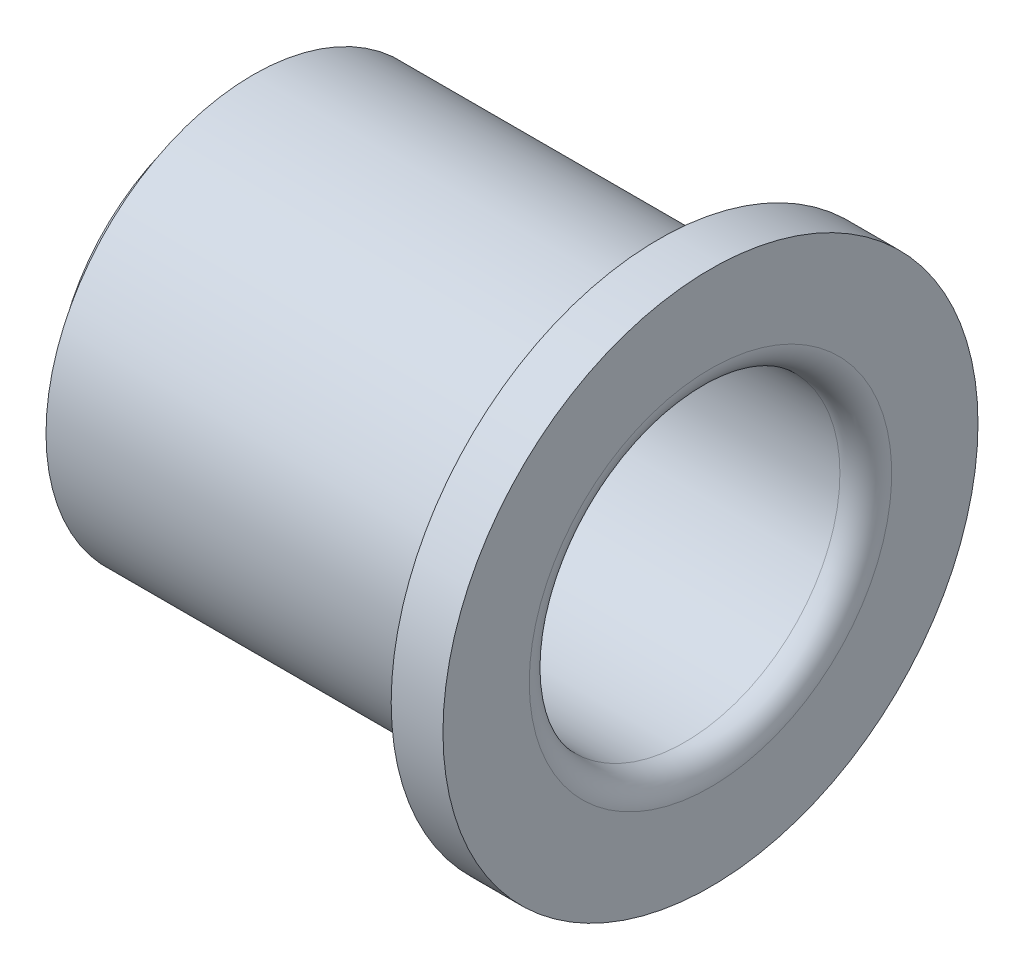
ISO-10303-21;
HEADER;
FILE_DESCRIPTION(('STEP AP214'),'2;1');
FILE_NAME('part.step','',(''),(''),'','','');
FILE_SCHEMA(('AUTOMOTIVE_DESIGN { 1 0 10303 214 1 1 1 1 }'));
ENDSEC;
DATA;
#1=APPLICATION_CONTEXT('core data for automotive mechanical design processes');
#2=APPLICATION_PROTOCOL_DEFINITION('international standard','automotive_design',2000,#1);
#3=PRODUCT_CONTEXT('',#1,'mechanical');
#4=PRODUCT('Part','Part','',(#3));
#5=PRODUCT_RELATED_PRODUCT_CATEGORY('part','',(#4));
#6=PRODUCT_DEFINITION_FORMATION('','',#4);
#7=PRODUCT_DEFINITION_CONTEXT('part definition',#1,'design');
#8=PRODUCT_DEFINITION('design','',#6,#7);
#9=PRODUCT_DEFINITION_SHAPE('','',#8);
#10=(LENGTH_UNIT() NAMED_UNIT(*) SI_UNIT(.MILLI.,.METRE.));
#11=(NAMED_UNIT(*) PLANE_ANGLE_UNIT() SI_UNIT($,.RADIAN.));
#12=(NAMED_UNIT(*) SI_UNIT($,.STERADIAN.) SOLID_ANGLE_UNIT());
#13=UNCERTAINTY_MEASURE_WITH_UNIT(LENGTH_MEASURE(1.E-05),#10,'distance_accuracy_value','');
#14=(GEOMETRIC_REPRESENTATION_CONTEXT(3) GLOBAL_UNCERTAINTY_ASSIGNED_CONTEXT((#13)) GLOBAL_UNIT_ASSIGNED_CONTEXT((#10,
#11,#12)) REPRESENTATION_CONTEXT('',''));
#15=CARTESIAN_POINT('',(0.,0.,0.));
#16=DIRECTION('',(0.,0.,1.));
#17=DIRECTION('',(1.,0.,0.));
#18=AXIS2_PLACEMENT_3D('',#15,#16,#17);
#19=CARTESIAN_POINT('',(-56.,20.,0.));
#20=DIRECTION('',(1.,0.,0.));
#21=DIRECTION('',(0.,0.,-1.));
#22=AXIS2_PLACEMENT_3D('',#19,#20,#21);
#23=PLANE('',#22);
#24=CARTESIAN_POINT('',(-56.,0.,0.));
#25=DIRECTION('',(-1.,0.,0.));
#26=DIRECTION('',(0.,0.,1.));
#27=AXIS2_PLACEMENT_3D('',#24,#25,#26);
#28=CIRCLE('',#27,18.);
#29=CARTESIAN_POINT('',(-56.,0.,18.));
#30=VERTEX_POINT('',#29);
#31=EDGE_CURVE('E10',#30,#30,#28,.T.);
#32=ORIENTED_EDGE('',*,*,#31,.F.);
#33=EDGE_LOOP('',(#32));
#34=FACE_BOUND('',#33,.T.);
#35=CARTESIAN_POINT('',(-56.,0.,0.));
#36=DIRECTION('',(-1.,0.,0.));
#37=DIRECTION('',(0.,0.,1.));
#38=AXIS2_PLACEMENT_3D('',#35,#36,#37);
#39=CIRCLE('',#38,20.);
#40=CARTESIAN_POINT('',(-56.,0.,20.));
#41=VERTEX_POINT('',#40);
#42=EDGE_CURVE('E377',#41,#41,#39,.T.);
#43=ORIENTED_EDGE('',*,*,#42,.T.);
#44=EDGE_LOOP('',(#43));
#45=FACE_BOUND('',#44,.T.);
#46=ADVANCED_FACE('F346',(#34,#45),#23,.F.);
#47=CARTESIAN_POINT('',(-50.6851256281407,0.,0.));
#48=DIRECTION('',(-1.,0.,0.));
#49=DIRECTION('',(0.,0.,1.));
#50=AXIS2_PLACEMENT_3D('',#47,#48,#49);
#51=CYLINDRICAL_SURFACE('',#50,18.);
#52=CARTESIAN_POINT('',(-3.00000000000002,0.,0.));
#53=DIRECTION('',(-1.,0.,0.));
#54=DIRECTION('',(0.,0.,1.));
#55=AXIS2_PLACEMENT_3D('',#52,#53,#54);
#56=CIRCLE('',#55,18.);
#57=CARTESIAN_POINT('',(-3.00000000000002,0.,18.));
#58=VERTEX_POINT('',#57);
#59=EDGE_CURVE('E352',#58,#58,#56,.T.);
#60=ORIENTED_EDGE('',*,*,#59,.F.);
#61=EDGE_LOOP('',(#60));
#62=FACE_BOUND('',#61,.T.);
#63=ORIENTED_EDGE('',*,*,#31,.T.);
#64=EDGE_LOOP('',(#63));
#65=FACE_BOUND('',#64,.T.);
#66=ADVANCED_FACE('F420',(#62,#65),#51,.F.);
#67=CARTESIAN_POINT('',(-3.,0.,0.));
#68=DIRECTION('',(-1.,0.,0.));
#69=DIRECTION('',(0.,0.,1.));
#70=AXIS2_PLACEMENT_3D('',#67,#68,#69);
#71=TOROIDAL_SURFACE('',#70,21.,3.);
#72=CARTESIAN_POINT('',(0.,0.,0.));
#73=DIRECTION('',(-1.,0.,0.));
#74=DIRECTION('',(0.,0.,1.));
#75=AXIS2_PLACEMENT_3D('',#72,#73,#74);
#76=CIRCLE('',#75,21.);
#77=CARTESIAN_POINT('',(0.,0.,21.));
#78=VERTEX_POINT('',#77);
#79=EDGE_CURVE('E356',#78,#78,#76,.T.);
#80=ORIENTED_EDGE('',*,*,#79,.F.);
#81=EDGE_LOOP('',(#80));
#82=FACE_BOUND('',#81,.T.);
#83=ORIENTED_EDGE('',*,*,#59,.T.);
#84=EDGE_LOOP('',(#83));
#85=FACE_BOUND('',#84,.T.);
#86=ADVANCED_FACE('F415',(#82,#85),#71,.T.);
#87=CARTESIAN_POINT('',(0.,21.,0.));
#88=DIRECTION('',(-1.,0.,0.));
#89=DIRECTION('',(0.,0.,1.));
#90=AXIS2_PLACEMENT_3D('',#87,#88,#89);
#91=PLANE('',#90);
#92=CARTESIAN_POINT('',(0.,0.,0.));
#93=DIRECTION('',(-1.,0.,0.));
#94=DIRECTION('',(0.,0.,1.));
#95=AXIS2_PLACEMENT_3D('',#92,#93,#94);
#96=CIRCLE('',#95,31.);
#97=CARTESIAN_POINT('',(0.,0.,31.));
#98=VERTEX_POINT('',#97);
#99=EDGE_CURVE('E360',#98,#98,#96,.T.);
#100=ORIENTED_EDGE('',*,*,#99,.F.);
#101=EDGE_LOOP('',(#100));
#102=FACE_BOUND('',#101,.T.);
#103=ORIENTED_EDGE('',*,*,#79,.T.);
#104=EDGE_LOOP('',(#103));
#105=FACE_BOUND('',#104,.T.);
#106=ADVANCED_FACE('F409',(#102,#105),#91,.F.);
#107=CARTESIAN_POINT('',(-50.6851256281407,0.,0.));
#108=DIRECTION('',(-1.,0.,0.));
#109=DIRECTION('',(0.,0.,1.));
#110=AXIS2_PLACEMENT_3D('',#107,#108,#109);
#111=CYLINDRICAL_SURFACE('',#110,31.);
#112=CARTESIAN_POINT('',(-6.,0.,0.));
#113=DIRECTION('',(-1.,0.,0.));
#114=DIRECTION('',(0.,0.,1.));
#115=AXIS2_PLACEMENT_3D('',#112,#113,#114);
#116=CIRCLE('',#115,31.);
#117=CARTESIAN_POINT('',(-6.,0.,31.));
#118=VERTEX_POINT('',#117);
#119=EDGE_CURVE('E365',#118,#118,#116,.T.);
#120=ORIENTED_EDGE('',*,*,#119,.F.);
#121=EDGE_LOOP('',(#120));
#122=FACE_BOUND('',#121,.T.);
#123=ORIENTED_EDGE('',*,*,#99,.T.);
#124=EDGE_LOOP('',(#123));
#125=FACE_BOUND('',#124,.T.);
#126=ADVANCED_FACE('F403',(#122,#125),#111,.T.);
#127=CARTESIAN_POINT('',(-6.,31.,0.));
#128=DIRECTION('',(1.,0.,0.));
#129=DIRECTION('',(0.,0.,-1.));
#130=AXIS2_PLACEMENT_3D('',#127,#128,#129);
#131=PLANE('',#130);
#132=CARTESIAN_POINT('',(-6.00000000000001,0.,0.));
#133=DIRECTION('',(-1.,0.,0.));
#134=DIRECTION('',(0.,0.,1.));
#135=AXIS2_PLACEMENT_3D('',#132,#133,#134);
#136=CIRCLE('',#135,24.);
#137=CARTESIAN_POINT('',(-6.00000000000001,0.,24.));
#138=VERTEX_POINT('',#137);
#139=EDGE_CURVE('E368',#138,#138,#136,.T.);
#140=ORIENTED_EDGE('',*,*,#139,.F.);
#141=EDGE_LOOP('',(#140));
#142=FACE_BOUND('',#141,.T.);
#143=ORIENTED_EDGE('',*,*,#119,.T.);
#144=EDGE_LOOP('',(#143));
#145=FACE_BOUND('',#144,.T.);
#146=ADVANCED_FACE('F397',(#142,#145),#131,.F.);
#147=CARTESIAN_POINT('',(-50.6851256281407,0.,0.));
#148=DIRECTION('',(-1.,0.,0.));
#149=DIRECTION('',(0.,0.,1.));
#150=AXIS2_PLACEMENT_3D('',#147,#148,#149);
#151=CYLINDRICAL_SURFACE('',#150,24.);
#152=CARTESIAN_POINT('',(-53.,0.,0.));
#153=DIRECTION('',(-1.,0.,0.));
#154=DIRECTION('',(0.,0.,1.));
#155=AXIS2_PLACEMENT_3D('',#152,#153,#154);
#156=CIRCLE('',#155,24.);
#157=CARTESIAN_POINT('',(-53.,0.,24.));
#158=VERTEX_POINT('',#157);
#159=EDGE_CURVE('E371',#158,#158,#156,.T.);
#160=ORIENTED_EDGE('',*,*,#159,.F.);
#161=EDGE_LOOP('',(#160));
#162=FACE_BOUND('',#161,.T.);
#163=ORIENTED_EDGE('',*,*,#139,.T.);
#164=EDGE_LOOP('',(#163));
#165=FACE_BOUND('',#164,.T.);
#166=ADVANCED_FACE('F391',(#162,#165),#151,.T.);
#167=CARTESIAN_POINT('',(-53.,24.,0.));
#168=DIRECTION('',(1.,0.,0.));
#169=DIRECTION('',(0.,0.,-1.));
#170=AXIS2_PLACEMENT_3D('',#167,#168,#169);
#171=PLANE('',#170);
#172=CARTESIAN_POINT('',(-53.,0.,0.));
#173=DIRECTION('',(-1.,0.,0.));
#174=DIRECTION('',(0.,0.,1.));
#175=AXIS2_PLACEMENT_3D('',#172,#173,#174);
#176=CIRCLE('',#175,20.);
#177=CARTESIAN_POINT('',(-53.,0.,20.));
#178=VERTEX_POINT('',#177);
#179=EDGE_CURVE('E374',#178,#178,#176,.T.);
#180=ORIENTED_EDGE('',*,*,#179,.F.);
#181=EDGE_LOOP('',(#180));
#182=FACE_BOUND('',#181,.T.);
#183=ORIENTED_EDGE('',*,*,#159,.T.);
#184=EDGE_LOOP('',(#183));
#185=FACE_BOUND('',#184,.T.);
#186=ADVANCED_FACE('F385',(#182,#185),#171,.F.);
#187=CARTESIAN_POINT('',(-50.6851256281407,0.,0.));
#188=DIRECTION('',(-1.,0.,0.));
#189=DIRECTION('',(0.,0.,1.));
#190=AXIS2_PLACEMENT_3D('',#187,#188,#189);
#191=CYLINDRICAL_SURFACE('',#190,20.);
#192=ORIENTED_EDGE('',*,*,#42,.F.);
#193=EDGE_LOOP('',(#192));
#194=FACE_BOUND('',#193,.T.);
#195=ORIENTED_EDGE('',*,*,#179,.T.);
#196=EDGE_LOOP('',(#195));
#197=FACE_BOUND('',#196,.T.);
#198=ADVANCED_FACE('F382',(#194,#197),#191,.T.);
#199=CLOSED_SHELL('',(#46,#66,#86,#106,#126,#146,#166,#186,#198));
#200=MANIFOLD_SOLID_BREP('B2',#199);
#201=ADVANCED_BREP_SHAPE_REPRESENTATION('',(#18,#200),#14);
#202=SHAPE_DEFINITION_REPRESENTATION(#9,#201);
ENDSEC;
END-ISO-10303-21;
